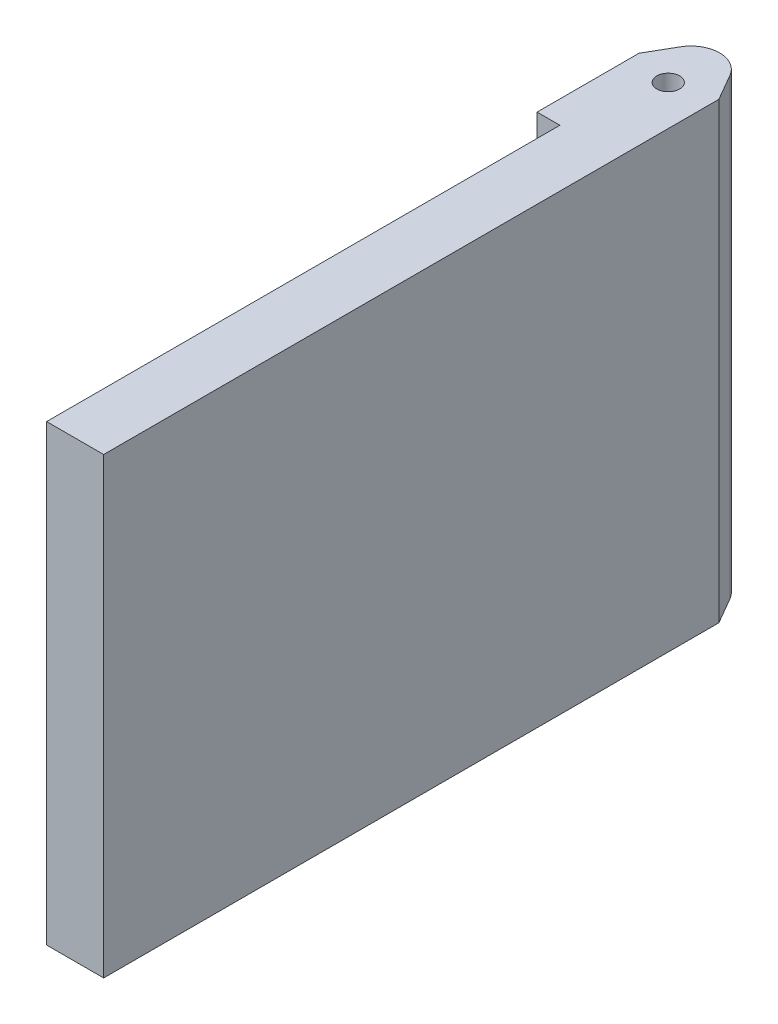
ISO-10303-21;
HEADER;
FILE_DESCRIPTION(('STEP AP214'),'2;1');
FILE_NAME('part.step','',(''),(''),'','','');
FILE_SCHEMA(('AUTOMOTIVE_DESIGN { 1 0 10303 214 1 1 1 1 }'));
ENDSEC;
DATA;
#1=APPLICATION_CONTEXT('core data for automotive mechanical design processes');
#2=APPLICATION_PROTOCOL_DEFINITION('international standard','automotive_design',2000,#1);
#3=PRODUCT_CONTEXT('',#1,'mechanical');
#4=PRODUCT('Part','Part','',(#3));
#5=PRODUCT_RELATED_PRODUCT_CATEGORY('part','',(#4));
#6=PRODUCT_DEFINITION_FORMATION('','',#4);
#7=PRODUCT_DEFINITION_CONTEXT('part definition',#1,'design');
#8=PRODUCT_DEFINITION('design','',#6,#7);
#9=PRODUCT_DEFINITION_SHAPE('','',#8);
#10=(LENGTH_UNIT() NAMED_UNIT(*) SI_UNIT(.MILLI.,.METRE.));
#11=(NAMED_UNIT(*) PLANE_ANGLE_UNIT() SI_UNIT($,.RADIAN.));
#12=(NAMED_UNIT(*) SI_UNIT($,.STERADIAN.) SOLID_ANGLE_UNIT());
#13=UNCERTAINTY_MEASURE_WITH_UNIT(LENGTH_MEASURE(1.E-05),#10,'distance_accuracy_value','');
#14=(GEOMETRIC_REPRESENTATION_CONTEXT(3) GLOBAL_UNCERTAINTY_ASSIGNED_CONTEXT((#13)) GLOBAL_UNIT_ASSIGNED_CONTEXT((#10,
#11,#12)) REPRESENTATION_CONTEXT('',''));
#15=CARTESIAN_POINT('',(0.,0.,0.));
#16=DIRECTION('',(0.,0.,1.));
#17=DIRECTION('',(1.,0.,0.));
#18=AXIS2_PLACEMENT_3D('',#15,#16,#17);
#19=CARTESIAN_POINT('',(0.,0.,-50.));
#20=DIRECTION('',(0.,-1.,0.));
#21=DIRECTION('',(0.,0.,-1.));
#22=AXIS2_PLACEMENT_3D('',#19,#20,#21);
#23=CYLINDRICAL_SURFACE('',#22,5.);
#24=DIRECTION('',(0.,-1.,0.));
#25=VECTOR('',#24,1.);
#26=CARTESIAN_POINT('',(-4.3301270189222,0.,-52.5));
#27=LINE('',#26,#25);
#28=CARTESIAN_POINT('',(-4.33012701892219,79.5,-52.5));
#29=VERTEX_POINT('',#28);
#30=CARTESIAN_POINT('',(-4.33012701892219,0.,-52.5));
#31=VERTEX_POINT('',#30);
#32=EDGE_CURVE('E122',#29,#31,#27,.T.);
#33=ORIENTED_EDGE('',*,*,#32,.F.);
#34=CARTESIAN_POINT('',(0.,79.5,-50.));
#35=DIRECTION('',(0.,-1.,0.));
#36=DIRECTION('',(0.,0.,-1.));
#37=AXIS2_PLACEMENT_3D('',#34,#35,#36);
#38=CIRCLE('',#37,5.);
#39=CARTESIAN_POINT('',(4.33012701892221,79.5,-52.5));
#40=VERTEX_POINT('',#39);
#41=EDGE_CURVE('E41',#40,#29,#38,.F.);
#42=ORIENTED_EDGE('',*,*,#41,.F.);
#43=DIRECTION('',(0.,-1.,0.));
#44=VECTOR('',#43,1.);
#45=CARTESIAN_POINT('',(4.33012701892221,0.,-52.5));
#46=LINE('',#45,#44);
#47=CARTESIAN_POINT('',(4.33012701892221,0.,-52.5));
#48=VERTEX_POINT('',#47);
#49=EDGE_CURVE('E131',#48,#40,#46,.F.);
#50=ORIENTED_EDGE('',*,*,#49,.F.);
#51=CARTESIAN_POINT('',(0.,0.,-50.));
#52=DIRECTION('',(0.,-1.,0.));
#53=DIRECTION('',(0.,0.,-1.));
#54=AXIS2_PLACEMENT_3D('',#51,#52,#53);
#55=CIRCLE('',#54,5.);
#56=EDGE_CURVE('E12',#31,#48,#55,.T.);
#57=ORIENTED_EDGE('',*,*,#56,.F.);
#58=EDGE_LOOP('',(#33,#42,#50,#57));
#59=FACE_BOUND('',#58,.T.);
#60=ADVANCED_FACE('F34',(#59),#23,.T.);
#61=CARTESIAN_POINT('',(0.,79.5,0.));
#62=DIRECTION('',(0.,-1.,0.));
#63=DIRECTION('',(0.,0.,-1.));
#64=AXIS2_PLACEMENT_3D('',#61,#62,#63);
#65=PLANE('',#64);
#66=CARTESIAN_POINT('',(0.,79.5,-46.));
#67=DIRECTION('',(0.,1.,0.));
#68=DIRECTION('',(0.,0.,1.));
#69=AXIS2_PLACEMENT_3D('',#66,#67,#68);
#70=CIRCLE('',#69,2.);
#71=CARTESIAN_POINT('',(0.,79.5,-44.));
#72=VERTEX_POINT('',#71);
#73=EDGE_CURVE('E176',#72,#72,#70,.T.);
#74=ORIENTED_EDGE('',*,*,#73,.F.);
#75=EDGE_LOOP('',(#74));
#76=FACE_BOUND('',#75,.T.);
#77=DIRECTION('',(0.,0.,-1.));
#78=VECTOR('',#77,1.);
#79=CARTESIAN_POINT('',(-6.99999999999999,79.5,60.));
#80=LINE('',#79,#78);
#81=CARTESIAN_POINT('',(-6.99999999999999,79.5,-30.));
#82=VERTEX_POINT('',#81);
#83=CARTESIAN_POINT('',(-6.99999999999998,79.5,-47.8756443470178));
#84=VERTEX_POINT('',#83);
#85=EDGE_CURVE('E157',#82,#84,#80,.T.);
#86=ORIENTED_EDGE('',*,*,#85,.F.);
#87=DIRECTION('',(-1.,0.,0.));
#88=VECTOR('',#87,1.);
#89=CARTESIAN_POINT('',(-6.99999999999999,79.5,-30.));
#90=LINE('',#89,#88);
#91=CARTESIAN_POINT('',(-2.99999999999999,79.5,-30.));
#92=VERTEX_POINT('',#91);
#93=EDGE_CURVE('E48',#92,#82,#90,.T.);
#94=ORIENTED_EDGE('',*,*,#93,.F.);
#95=DIRECTION('',(0.,0.,-1.));
#96=VECTOR('',#95,1.);
#97=CARTESIAN_POINT('',(-2.99999999999999,79.5,-30.));
#98=LINE('',#97,#96);
#99=CARTESIAN_POINT('',(-2.99999999999998,79.5,60.));
#100=VERTEX_POINT('',#99);
#101=EDGE_CURVE('E172',#100,#92,#98,.T.);
#102=ORIENTED_EDGE('',*,*,#101,.F.);
#103=DIRECTION('',(1.,0.,0.));
#104=VECTOR('',#103,1.);
#105=CARTESIAN_POINT('',(-15.,79.5,60.));
#106=LINE('',#105,#104);
#107=CARTESIAN_POINT('',(7.,79.5,60.));
#108=VERTEX_POINT('',#107);
#109=EDGE_CURVE('E116',#100,#108,#106,.T.);
#110=ORIENTED_EDGE('',*,*,#109,.T.);
#111=DIRECTION('',(0.,0.,1.));
#112=VECTOR('',#111,1.);
#113=CARTESIAN_POINT('',(6.99999999999999,79.5,-47.8756443470177));
#114=LINE('',#113,#112);
#115=CARTESIAN_POINT('',(6.99999999999999,79.5,-47.8756443470177));
#116=VERTEX_POINT('',#115);
#117=EDGE_CURVE('E164',#116,#108,#114,.T.);
#118=ORIENTED_EDGE('',*,*,#117,.F.);
#119=DIRECTION('',(-0.499999999999998,0.,-0.86602540378444));
#120=VECTOR('',#119,1.);
#121=CARTESIAN_POINT('',(15.,79.5,-34.0192378864667));
#122=LINE('',#121,#120);
#123=EDGE_CURVE('E143',#116,#40,#122,.T.);
#124=ORIENTED_EDGE('',*,*,#123,.T.);
#125=ORIENTED_EDGE('',*,*,#41,.T.);
#126=DIRECTION('',(-0.499999999999998,0.,0.86602540378444));
#127=VECTOR('',#126,1.);
#128=CARTESIAN_POINT('',(0.,79.5,-60.));
#129=LINE('',#128,#127);
#130=EDGE_CURVE('E140',#29,#84,#129,.T.);
#131=ORIENTED_EDGE('',*,*,#130,.T.);
#132=EDGE_LOOP('',(#86,#94,#102,#110,#118,#124,#125,#131));
#133=FACE_BOUND('',#132,.T.);
#134=ADVANCED_FACE('F138',(#76,#133),#65,.F.);
#135=CARTESIAN_POINT('',(0.,0.,0.));
#136=DIRECTION('',(0.,-1.,0.));
#137=DIRECTION('',(0.,0.,-1.));
#138=AXIS2_PLACEMENT_3D('',#135,#136,#137);
#139=PLANE('',#138);
#140=CARTESIAN_POINT('',(0.,0.,-46.));
#141=DIRECTION('',(0.,1.,0.));
#142=DIRECTION('',(0.,0.,1.));
#143=AXIS2_PLACEMENT_3D('',#140,#141,#142);
#144=CIRCLE('',#143,2.);
#145=CARTESIAN_POINT('',(0.,0.,-44.));
#146=VERTEX_POINT('',#145);
#147=EDGE_CURVE('E174',#146,#146,#144,.T.);
#148=ORIENTED_EDGE('',*,*,#147,.T.);
#149=EDGE_LOOP('',(#148));
#150=FACE_BOUND('',#149,.T.);
#151=DIRECTION('',(-1.,0.,0.));
#152=VECTOR('',#151,1.);
#153=CARTESIAN_POINT('',(-6.99999999999999,0.,-30.));
#154=LINE('',#153,#152);
#155=CARTESIAN_POINT('',(-2.99999999999999,0.,-30.));
#156=VERTEX_POINT('',#155);
#157=CARTESIAN_POINT('',(-6.99999999999999,0.,-30.));
#158=VERTEX_POINT('',#157);
#159=EDGE_CURVE('E109',#156,#158,#154,.T.);
#160=ORIENTED_EDGE('',*,*,#159,.T.);
#161=DIRECTION('',(0.,0.,-1.));
#162=VECTOR('',#161,1.);
#163=CARTESIAN_POINT('',(-6.99999999999999,0.,60.));
#164=LINE('',#163,#162);
#165=CARTESIAN_POINT('',(-6.99999999999999,0.,-47.8756443470178));
#166=VERTEX_POINT('',#165);
#167=EDGE_CURVE('E156',#158,#166,#164,.T.);
#168=ORIENTED_EDGE('',*,*,#167,.T.);
#169=DIRECTION('',(-0.499999999999998,0.,0.86602540378444));
#170=VECTOR('',#169,1.);
#171=CARTESIAN_POINT('',(0.,0.,-60.));
#172=LINE('',#171,#170);
#173=EDGE_CURVE('E120',#31,#166,#172,.T.);
#174=ORIENTED_EDGE('',*,*,#173,.F.);
#175=ORIENTED_EDGE('',*,*,#56,.T.);
#176=DIRECTION('',(-0.499999999999998,0.,-0.86602540378444));
#177=VECTOR('',#176,1.);
#178=CARTESIAN_POINT('',(15.,0.,-34.0192378864667));
#179=LINE('',#178,#177);
#180=CARTESIAN_POINT('',(7.00000000000003,0.,-47.8756443470177));
#181=VERTEX_POINT('',#180);
#182=EDGE_CURVE('E125',#181,#48,#179,.T.);
#183=ORIENTED_EDGE('',*,*,#182,.F.);
#184=DIRECTION('',(0.,0.,1.));
#185=VECTOR('',#184,1.);
#186=CARTESIAN_POINT('',(6.99999999999999,0.,-47.8756443470177));
#187=LINE('',#186,#185);
#188=CARTESIAN_POINT('',(7.,0.,60.));
#189=VERTEX_POINT('',#188);
#190=EDGE_CURVE('E56',#181,#189,#187,.T.);
#191=ORIENTED_EDGE('',*,*,#190,.T.);
#192=DIRECTION('',(1.,0.,0.));
#193=VECTOR('',#192,1.);
#194=CARTESIAN_POINT('',(-15.,0.,60.));
#195=LINE('',#194,#193);
#196=CARTESIAN_POINT('',(-2.99999999999998,0.,60.));
#197=VERTEX_POINT('',#196);
#198=EDGE_CURVE('E115',#197,#189,#195,.T.);
#199=ORIENTED_EDGE('',*,*,#198,.F.);
#200=DIRECTION('',(0.,0.,-1.));
#201=VECTOR('',#200,1.);
#202=CARTESIAN_POINT('',(-2.99999999999999,0.,-30.));
#203=LINE('',#202,#201);
#204=EDGE_CURVE('E98',#197,#156,#203,.T.);
#205=ORIENTED_EDGE('',*,*,#204,.T.);
#206=EDGE_LOOP('',(#160,#168,#174,#175,#183,#191,#199,#205));
#207=FACE_BOUND('',#206,.T.);
#208=ADVANCED_FACE('F118',(#150,#207),#139,.T.);
#209=CARTESIAN_POINT('',(-15.,79.5,60.));
#210=DIRECTION('',(0.,0.,-1.));
#211=DIRECTION('',(-1.,0.,0.));
#212=AXIS2_PLACEMENT_3D('',#209,#210,#211);
#213=PLANE('',#212);
#214=ORIENTED_EDGE('',*,*,#109,.F.);
#215=DIRECTION('',(0.,1.,0.));
#216=VECTOR('',#215,1.);
#217=CARTESIAN_POINT('',(-2.99999999999998,0.,60.));
#218=LINE('',#217,#216);
#219=EDGE_CURVE('E102',#197,#100,#218,.T.);
#220=ORIENTED_EDGE('',*,*,#219,.F.);
#221=ORIENTED_EDGE('',*,*,#198,.T.);
#222=DIRECTION('',(0.,1.,0.));
#223=VECTOR('',#222,1.);
#224=CARTESIAN_POINT('',(7.,0.,60.));
#225=LINE('',#224,#223);
#226=EDGE_CURVE('E159',#189,#108,#225,.T.);
#227=ORIENTED_EDGE('',*,*,#226,.T.);
#228=EDGE_LOOP('',(#214,#220,#221,#227));
#229=FACE_BOUND('',#228,.T.);
#230=ADVANCED_FACE('F113',(#229),#213,.F.);
#231=CARTESIAN_POINT('',(15.,0.,-34.0192378864667));
#232=DIRECTION('',(0.86602540378444,0.,-0.499999999999998));
#233=DIRECTION('',(-0.499999999999998,0.,-0.86602540378444));
#234=AXIS2_PLACEMENT_3D('',#231,#232,#233);
#235=PLANE('',#234);
#236=DIRECTION('',(0.,1.,0.));
#237=VECTOR('',#236,1.);
#238=CARTESIAN_POINT('',(6.99999999999999,0.,-47.8756443470177));
#239=LINE('',#238,#237);
#240=EDGE_CURVE('E161',#181,#116,#239,.T.);
#241=ORIENTED_EDGE('',*,*,#240,.F.);
#242=ORIENTED_EDGE('',*,*,#182,.T.);
#243=ORIENTED_EDGE('',*,*,#49,.T.);
#244=ORIENTED_EDGE('',*,*,#123,.F.);
#245=EDGE_LOOP('',(#241,#242,#243,#244));
#246=FACE_BOUND('',#245,.T.);
#247=ADVANCED_FACE('F198',(#246),#235,.T.);
#248=CARTESIAN_POINT('',(0.,0.,-60.));
#249=DIRECTION('',(-0.86602540378444,0.,-0.499999999999998));
#250=DIRECTION('',(-0.499999999999998,0.,0.86602540378444));
#251=AXIS2_PLACEMENT_3D('',#248,#249,#250);
#252=PLANE('',#251);
#253=DIRECTION('',(0.,1.,0.));
#254=VECTOR('',#253,1.);
#255=CARTESIAN_POINT('',(-6.99999999999999,0.,-47.8756443470178));
#256=LINE('',#255,#254);
#257=EDGE_CURVE('E151',#166,#84,#256,.T.);
#258=ORIENTED_EDGE('',*,*,#257,.T.);
#259=ORIENTED_EDGE('',*,*,#130,.F.);
#260=ORIENTED_EDGE('',*,*,#32,.T.);
#261=ORIENTED_EDGE('',*,*,#173,.T.);
#262=EDGE_LOOP('',(#258,#259,#260,#261));
#263=FACE_BOUND('',#262,.T.);
#264=ADVANCED_FACE('F149',(#263),#252,.T.);
#265=CARTESIAN_POINT('',(-6.99999999999999,0.,60.));
#266=DIRECTION('',(1.,0.,0.));
#267=DIRECTION('',(0.,0.,-1.));
#268=AXIS2_PLACEMENT_3D('',#265,#266,#267);
#269=PLANE('',#268);
#270=ORIENTED_EDGE('',*,*,#167,.F.);
#271=DIRECTION('',(0.,1.,0.));
#272=VECTOR('',#271,1.);
#273=CARTESIAN_POINT('',(-6.99999999999999,0.,-30.));
#274=LINE('',#273,#272);
#275=EDGE_CURVE('E167',#158,#82,#274,.T.);
#276=ORIENTED_EDGE('',*,*,#275,.T.);
#277=ORIENTED_EDGE('',*,*,#85,.T.);
#278=ORIENTED_EDGE('',*,*,#257,.F.);
#279=EDGE_LOOP('',(#270,#276,#277,#278));
#280=FACE_BOUND('',#279,.T.);
#281=ADVANCED_FACE('F209',(#280),#269,.F.);
#282=CARTESIAN_POINT('',(6.99999999999999,0.,-47.8756443470177));
#283=DIRECTION('',(-1.,0.,0.));
#284=DIRECTION('',(0.,0.,1.));
#285=AXIS2_PLACEMENT_3D('',#282,#283,#284);
#286=PLANE('',#285);
#287=ORIENTED_EDGE('',*,*,#117,.T.);
#288=ORIENTED_EDGE('',*,*,#226,.F.);
#289=ORIENTED_EDGE('',*,*,#190,.F.);
#290=ORIENTED_EDGE('',*,*,#240,.T.);
#291=EDGE_LOOP('',(#287,#288,#289,#290));
#292=FACE_BOUND('',#291,.T.);
#293=ADVANCED_FACE('F212',(#292),#286,.F.);
#294=CARTESIAN_POINT('',(-6.99999999999999,0.,-30.));
#295=DIRECTION('',(0.,0.,-1.));
#296=DIRECTION('',(-1.,0.,0.));
#297=AXIS2_PLACEMENT_3D('',#294,#295,#296);
#298=PLANE('',#297);
#299=ORIENTED_EDGE('',*,*,#93,.T.);
#300=ORIENTED_EDGE('',*,*,#275,.F.);
#301=ORIENTED_EDGE('',*,*,#159,.F.);
#302=DIRECTION('',(0.,1.,0.));
#303=VECTOR('',#302,1.);
#304=CARTESIAN_POINT('',(-2.99999999999999,0.,-30.));
#305=LINE('',#304,#303);
#306=EDGE_CURVE('E104',#156,#92,#305,.T.);
#307=ORIENTED_EDGE('',*,*,#306,.T.);
#308=EDGE_LOOP('',(#299,#300,#301,#307));
#309=FACE_BOUND('',#308,.T.);
#310=ADVANCED_FACE('F214',(#309),#298,.F.);
#311=CARTESIAN_POINT('',(-2.99999999999999,0.,-30.));
#312=DIRECTION('',(1.,0.,0.));
#313=DIRECTION('',(0.,0.,-1.));
#314=AXIS2_PLACEMENT_3D('',#311,#312,#313);
#315=PLANE('',#314);
#316=ORIENTED_EDGE('',*,*,#101,.T.);
#317=ORIENTED_EDGE('',*,*,#306,.F.);
#318=ORIENTED_EDGE('',*,*,#204,.F.);
#319=ORIENTED_EDGE('',*,*,#219,.T.);
#320=EDGE_LOOP('',(#316,#317,#318,#319));
#321=FACE_BOUND('',#320,.T.);
#322=ADVANCED_FACE('F101',(#321),#315,.F.);
#323=CARTESIAN_POINT('',(0.,0.,-46.));
#324=DIRECTION('',(0.,1.,0.));
#325=DIRECTION('',(0.,0.,1.));
#326=AXIS2_PLACEMENT_3D('',#323,#324,#325);
#327=CYLINDRICAL_SURFACE('',#326,2.);
#328=CARTESIAN_POINT('',(0.,0.,-44.));
#329=CARTESIAN_POINT('',(0.,0.828124999999999,-44.));
#330=CARTESIAN_POINT('',(0.,1.65625,-44.));
#331=CARTESIAN_POINT('',(0.,3.3125,-44.));
#332=CARTESIAN_POINT('',(0.,4.140625,-44.));
#333=CARTESIAN_POINT('',(0.,5.796875,-44.));
#334=CARTESIAN_POINT('',(0.,6.625,-44.));
#335=CARTESIAN_POINT('',(0.,8.28125,-44.));
#336=CARTESIAN_POINT('',(0.,9.109375,-44.));
#337=CARTESIAN_POINT('',(0.,10.765625,-44.));
#338=CARTESIAN_POINT('',(0.,11.59375,-44.));
#339=CARTESIAN_POINT('',(0.,13.25,-44.));
#340=CARTESIAN_POINT('',(0.,14.078125,-44.));
#341=CARTESIAN_POINT('',(0.,15.734375,-44.));
#342=CARTESIAN_POINT('',(0.,16.5625,-44.));
#343=CARTESIAN_POINT('',(0.,18.21875,-44.));
#344=CARTESIAN_POINT('',(0.,19.046875,-44.));
#345=CARTESIAN_POINT('',(0.,20.703125,-44.));
#346=CARTESIAN_POINT('',(0.,21.53125,-44.));
#347=CARTESIAN_POINT('',(0.,23.1875,-44.));
#348=CARTESIAN_POINT('',(0.,24.015625,-44.));
#349=CARTESIAN_POINT('',(0.,25.671875,-44.));
#350=CARTESIAN_POINT('',(0.,26.5,-44.));
#351=CARTESIAN_POINT('',(0.,28.15625,-44.));
#352=CARTESIAN_POINT('',(0.,28.984375,-44.));
#353=CARTESIAN_POINT('',(0.,30.640625,-44.));
#354=CARTESIAN_POINT('',(0.,31.46875,-44.));
#355=CARTESIAN_POINT('',(0.,33.125,-44.));
#356=CARTESIAN_POINT('',(0.,33.953125,-44.));
#357=CARTESIAN_POINT('',(0.,35.609375,-44.));
#358=CARTESIAN_POINT('',(0.,36.4375,-44.));
#359=CARTESIAN_POINT('',(0.,38.09375,-44.));
#360=CARTESIAN_POINT('',(0.,38.921875,-44.));
#361=CARTESIAN_POINT('',(0.,40.578125,-44.));
#362=CARTESIAN_POINT('',(0.,41.40625,-44.));
#363=CARTESIAN_POINT('',(0.,43.0625,-44.));
#364=CARTESIAN_POINT('',(0.,43.890625,-44.));
#365=CARTESIAN_POINT('',(0.,45.546875,-44.));
#366=CARTESIAN_POINT('',(0.,46.375,-44.));
#367=CARTESIAN_POINT('',(0.,48.03125,-44.));
#368=CARTESIAN_POINT('',(0.,48.859375,-44.));
#369=CARTESIAN_POINT('',(0.,50.515625,-44.));
#370=CARTESIAN_POINT('',(0.,51.34375,-44.));
#371=CARTESIAN_POINT('',(0.,53.,-44.));
#372=CARTESIAN_POINT('',(0.,53.828125,-44.));
#373=CARTESIAN_POINT('',(0.,55.484375,-44.));
#374=CARTESIAN_POINT('',(0.,56.3125,-44.));
#375=CARTESIAN_POINT('',(0.,57.96875,-44.));
#376=CARTESIAN_POINT('',(0.,58.796875,-44.));
#377=CARTESIAN_POINT('',(0.,60.453125,-44.));
#378=CARTESIAN_POINT('',(0.,61.28125,-44.));
#379=CARTESIAN_POINT('',(0.,62.9375,-44.));
#380=CARTESIAN_POINT('',(0.,63.765625,-44.));
#381=CARTESIAN_POINT('',(0.,65.421875,-44.));
#382=CARTESIAN_POINT('',(0.,66.25,-44.));
#383=CARTESIAN_POINT('',(0.,67.90625,-44.));
#384=CARTESIAN_POINT('',(0.,68.734375,-44.));
#385=CARTESIAN_POINT('',(0.,70.390625,-44.));
#386=CARTESIAN_POINT('',(0.,71.21875,-44.));
#387=CARTESIAN_POINT('',(0.,72.875,-44.));
#388=CARTESIAN_POINT('',(0.,73.703125,-44.));
#389=CARTESIAN_POINT('',(0.,75.359375,-44.));
#390=CARTESIAN_POINT('',(0.,76.1875,-44.));
#391=CARTESIAN_POINT('',(0.,77.84375,-44.));
#392=CARTESIAN_POINT('',(0.,78.671875,-44.));
#393=CARTESIAN_POINT('',(0.,79.5,-44.));
#394=B_SPLINE_CURVE_WITH_KNOTS('',3,(#328,#329,#330,#331,#332,#333,#334,#335,#336,#337,#338,
#339,#340,#341,#342,#343,#344,#345,#346,#347,#348,#349,#350,#351,#352,#353,#354,#355,#356,#357,
#358,#359,#360,#361,#362,#363,#364,#365,#366,#367,#368,#369,#370,#371,#372,#373,#374,#375,#376,
#377,#378,#379,#380,#381,#382,#383,#384,#385,#386,#387,#388,#389,#390,#391,#392,#393),
.UNSPECIFIED.,.F.,.F.,(4,2,2,2,2,2,2,2,2,2,2,2,2,2,2,2,2,2,2,2,2,2,2,2,2,2,2,2,2,2,2,2,4),(0.,
2.484375,4.96875,7.453125,9.9375,12.421875,14.90625,17.390625,19.875,22.359375,24.84375,
27.328125,29.8125,32.296875,34.78125,37.265625,39.75,42.234375,44.71875,47.203125,49.6875,
52.171875,54.65625,57.140625,59.625,62.109375,64.59375,67.078125,69.5625,72.046875,74.53125,
77.015625,79.5),.UNSPECIFIED.);
#395=EDGE_CURVE('BSEAM183',#146,#72,#394,.T.);
#396=ORIENTED_EDGE('',*,*,#147,.F.);
#397=ORIENTED_EDGE('',*,*,#73,.T.);
#398=ORIENTED_EDGE('',*,*,#395,.T.);
#399=ORIENTED_EDGE('',*,*,#395,.F.);
#400=EDGE_LOOP('',(#396,#398,#397,#399));
#401=FACE_BOUND('',#400,.T.);
#402=ADVANCED_FACE('F183',(#401),#327,.F.);
#403=CLOSED_SHELL('',(#60,#134,#208,#230,#247,#264,#281,#293,#310,#322,#402));
#404=MANIFOLD_SOLID_BREP('B2',#403);
#405=ADVANCED_BREP_SHAPE_REPRESENTATION('',(#18,#404),#14);
#406=SHAPE_DEFINITION_REPRESENTATION(#9,#405);
ENDSEC;
END-ISO-10303-21;
